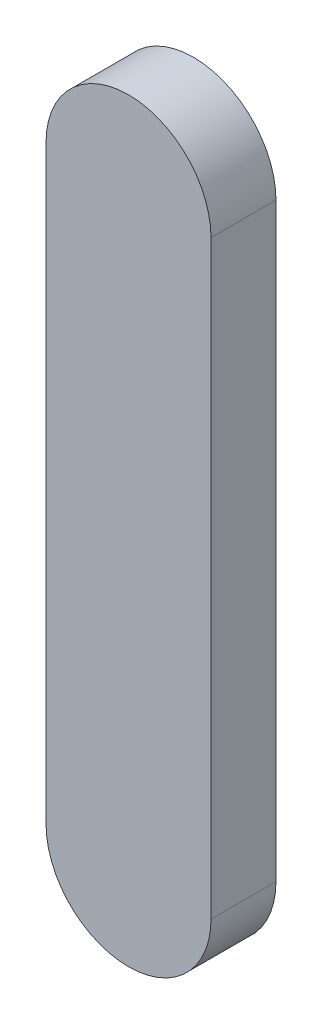
ISO-10303-21;
HEADER;
FILE_DESCRIPTION(('STEP AP214'),'2;1');
FILE_NAME('part.step','',(''),(''),'','','');
FILE_SCHEMA(('AUTOMOTIVE_DESIGN { 1 0 10303 214 1 1 1 1 }'));
ENDSEC;
DATA;
#1=APPLICATION_CONTEXT('core data for automotive mechanical design processes');
#2=APPLICATION_PROTOCOL_DEFINITION('international standard','automotive_design',2000,#1);
#3=PRODUCT_CONTEXT('',#1,'mechanical');
#4=PRODUCT('Part','Part','',(#3));
#5=PRODUCT_RELATED_PRODUCT_CATEGORY('part','',(#4));
#6=PRODUCT_DEFINITION_FORMATION('','',#4);
#7=PRODUCT_DEFINITION_CONTEXT('part definition',#1,'design');
#8=PRODUCT_DEFINITION('design','',#6,#7);
#9=PRODUCT_DEFINITION_SHAPE('','',#8);
#10=(LENGTH_UNIT() NAMED_UNIT(*) SI_UNIT(.MILLI.,.METRE.));
#11=(NAMED_UNIT(*) PLANE_ANGLE_UNIT() SI_UNIT($,.RADIAN.));
#12=(NAMED_UNIT(*) SI_UNIT($,.STERADIAN.) SOLID_ANGLE_UNIT());
#13=UNCERTAINTY_MEASURE_WITH_UNIT(LENGTH_MEASURE(1.E-05),#10,'distance_accuracy_value','');
#14=(GEOMETRIC_REPRESENTATION_CONTEXT(3) GLOBAL_UNCERTAINTY_ASSIGNED_CONTEXT((#13)) GLOBAL_UNIT_ASSIGNED_CONTEXT((#10,
#11,#12)) REPRESENTATION_CONTEXT('',''));
#15=CARTESIAN_POINT('',(0.,0.,0.));
#16=DIRECTION('',(0.,0.,1.));
#17=DIRECTION('',(1.,0.,0.));
#18=AXIS2_PLACEMENT_3D('',#15,#16,#17);
#19=CARTESIAN_POINT('',(138.049,61.087,0.));
#20=DIRECTION('',(-1.,0.,0.));
#21=DIRECTION('',(0.,1.,0.));
#22=AXIS2_PLACEMENT_3D('',#19,#20,#21);
#23=PLANE('',#22);
#24=DIRECTION('',(0.,1.,0.));
#25=VECTOR('',#24,1.);
#26=CARTESIAN_POINT('',(138.049,61.087,0.1999996));
#27=LINE('',#26,#25);
#28=CARTESIAN_POINT('',(138.049,61.087,0.1999996));
#29=VERTEX_POINT('',#28);
#30=CARTESIAN_POINT('',(138.049,62.904624,0.1999996));
#31=VERTEX_POINT('',#30);
#32=EDGE_CURVE('E11',#29,#31,#27,.T.);
#33=ORIENTED_EDGE('',*,*,#32,.F.);
#34=DIRECTION('',(0.,0.,1.));
#35=VECTOR('',#34,1.);
#36=CARTESIAN_POINT('',(138.049,61.087,0.));
#37=LINE('',#36,#35);
#38=CARTESIAN_POINT('',(138.049,61.087,0.));
#39=VERTEX_POINT('',#38);
#40=EDGE_CURVE('E24',#39,#29,#37,.T.);
#41=ORIENTED_EDGE('',*,*,#40,.F.);
#42=DIRECTION('',(0.,1.,0.));
#43=VECTOR('',#42,1.);
#44=CARTESIAN_POINT('',(138.049,61.087,0.));
#45=LINE('',#44,#43);
#46=CARTESIAN_POINT('',(138.049,62.904624,0.));
#47=VERTEX_POINT('',#46);
#48=EDGE_CURVE('E75',#39,#47,#45,.T.);
#49=ORIENTED_EDGE('',*,*,#48,.T.);
#50=DIRECTION('',(0.,0.,1.));
#51=VECTOR('',#50,1.);
#52=CARTESIAN_POINT('',(138.049,62.904624,0.));
#53=LINE('',#52,#51);
#54=EDGE_CURVE('E37',#47,#31,#53,.T.);
#55=ORIENTED_EDGE('',*,*,#54,.T.);
#56=EDGE_LOOP('',(#33,#41,#49,#55));
#57=FACE_BOUND('',#56,.T.);
#58=ADVANCED_FACE('F17',(#57),#23,.F.);
#59=CARTESIAN_POINT('',(137.795,62.904624,0.));
#60=DIRECTION('',(0.,0.,-1.));
#61=DIRECTION('',(1.,0.,0.));
#62=AXIS2_PLACEMENT_3D('',#59,#60,#61);
#63=CYLINDRICAL_SURFACE('',#62,0.254000000000003);
#64=CARTESIAN_POINT('',(137.795,62.904624,0.1999996));
#65=DIRECTION('',(0.,0.,1.));
#66=DIRECTION('',(1.,0.,0.));
#67=AXIS2_PLACEMENT_3D('',#64,#65,#66);
#68=CIRCLE('',#67,0.254000000000003);
#69=CARTESIAN_POINT('',(137.541,62.904624,0.1999996));
#70=VERTEX_POINT('',#69);
#71=EDGE_CURVE('E83',#31,#70,#68,.T.);
#72=ORIENTED_EDGE('',*,*,#71,.F.);
#73=ORIENTED_EDGE('',*,*,#54,.F.);
#74=CARTESIAN_POINT('',(137.795,62.904624,0.));
#75=DIRECTION('',(0.,0.,1.));
#76=DIRECTION('',(1.,0.,0.));
#77=AXIS2_PLACEMENT_3D('',#74,#75,#76);
#78=CIRCLE('',#77,0.254000000000003);
#79=CARTESIAN_POINT('',(137.541,62.904624,0.));
#80=VERTEX_POINT('',#79);
#81=EDGE_CURVE('E81',#47,#80,#78,.T.);
#82=ORIENTED_EDGE('',*,*,#81,.T.);
#83=DIRECTION('',(0.,0.,1.));
#84=VECTOR('',#83,1.);
#85=CARTESIAN_POINT('',(137.541,62.904624,0.));
#86=LINE('',#85,#84);
#87=EDGE_CURVE('E67',#80,#70,#86,.T.);
#88=ORIENTED_EDGE('',*,*,#87,.T.);
#89=EDGE_LOOP('',(#72,#73,#82,#88));
#90=FACE_BOUND('',#89,.T.);
#91=ADVANCED_FACE('F89',(#90),#63,.T.);
#92=CARTESIAN_POINT('',(137.541,62.904624,0.));
#93=DIRECTION('',(1.,0.,0.));
#94=DIRECTION('',(0.,-1.,0.));
#95=AXIS2_PLACEMENT_3D('',#92,#93,#94);
#96=PLANE('',#95);
#97=DIRECTION('',(0.,-1.,0.));
#98=VECTOR('',#97,1.);
#99=CARTESIAN_POINT('',(137.541,62.904624,0.1999996));
#100=LINE('',#99,#98);
#101=CARTESIAN_POINT('',(137.541,61.087,0.1999996));
#102=VERTEX_POINT('',#101);
#103=EDGE_CURVE('E71',#70,#102,#100,.T.);
#104=ORIENTED_EDGE('',*,*,#103,.F.);
#105=ORIENTED_EDGE('',*,*,#87,.F.);
#106=DIRECTION('',(0.,-1.,0.));
#107=VECTOR('',#106,1.);
#108=CARTESIAN_POINT('',(137.541,62.904624,0.));
#109=LINE('',#108,#107);
#110=CARTESIAN_POINT('',(137.541,61.087,0.));
#111=VERTEX_POINT('',#110);
#112=EDGE_CURVE('E63',#80,#111,#109,.T.);
#113=ORIENTED_EDGE('',*,*,#112,.T.);
#114=DIRECTION('',(0.,0.,1.));
#115=VECTOR('',#114,1.);
#116=CARTESIAN_POINT('',(137.541,61.087,0.));
#117=LINE('',#116,#115);
#118=EDGE_CURVE('E53',#111,#102,#117,.T.);
#119=ORIENTED_EDGE('',*,*,#118,.T.);
#120=EDGE_LOOP('',(#104,#105,#113,#119));
#121=FACE_BOUND('',#120,.T.);
#122=ADVANCED_FACE('F66',(#121),#96,.F.);
#123=CARTESIAN_POINT('',(137.795,61.087,0.));
#124=DIRECTION('',(0.,0.,-1.));
#125=DIRECTION('',(-1.,0.,0.));
#126=AXIS2_PLACEMENT_3D('',#123,#124,#125);
#127=CYLINDRICAL_SURFACE('',#126,0.254000000000005);
#128=CARTESIAN_POINT('',(137.795,61.087,0.1999996));
#129=DIRECTION('',(0.,0.,1.));
#130=DIRECTION('',(-1.,0.,0.));
#131=AXIS2_PLACEMENT_3D('',#128,#129,#130);
#132=CIRCLE('',#131,0.254000000000005);
#133=EDGE_CURVE('E59',#102,#29,#132,.T.);
#134=ORIENTED_EDGE('',*,*,#133,.F.);
#135=ORIENTED_EDGE('',*,*,#118,.F.);
#136=CARTESIAN_POINT('',(137.795,61.087,0.));
#137=DIRECTION('',(0.,0.,1.));
#138=DIRECTION('',(-1.,0.,0.));
#139=AXIS2_PLACEMENT_3D('',#136,#137,#138);
#140=CIRCLE('',#139,0.254000000000005);
#141=EDGE_CURVE('E57',#111,#39,#140,.T.);
#142=ORIENTED_EDGE('',*,*,#141,.T.);
#143=ORIENTED_EDGE('',*,*,#40,.T.);
#144=EDGE_LOOP('',(#134,#135,#142,#143));
#145=FACE_BOUND('',#144,.T.);
#146=ADVANCED_FACE('F55',(#145),#127,.T.);
#147=CARTESIAN_POINT('',(138.049,61.087,0.));
#148=DIRECTION('',(0.,0.,-1.));
#149=DIRECTION('',(-1.,0.,0.));
#150=AXIS2_PLACEMENT_3D('',#147,#148,#149);
#151=PLANE('',#150);
#152=ORIENTED_EDGE('',*,*,#141,.F.);
#153=ORIENTED_EDGE('',*,*,#112,.F.);
#154=ORIENTED_EDGE('',*,*,#81,.F.);
#155=ORIENTED_EDGE('',*,*,#48,.F.);
#156=EDGE_LOOP('',(#152,#153,#154,#155));
#157=FACE_BOUND('',#156,.T.);
#158=ADVANCED_FACE('F74',(#157),#151,.T.);
#159=CARTESIAN_POINT('',(138.049,61.087,0.1999996));
#160=DIRECTION('',(0.,0.,-1.));
#161=DIRECTION('',(-1.,0.,0.));
#162=AXIS2_PLACEMENT_3D('',#159,#160,#161);
#163=PLANE('',#162);
#164=ORIENTED_EDGE('',*,*,#32,.T.);
#165=ORIENTED_EDGE('',*,*,#71,.T.);
#166=ORIENTED_EDGE('',*,*,#103,.T.);
#167=ORIENTED_EDGE('',*,*,#133,.T.);
#168=EDGE_LOOP('',(#164,#165,#166,#167));
#169=FACE_BOUND('',#168,.T.);
#170=ADVANCED_FACE('F91',(#169),#163,.F.);
#171=CLOSED_SHELL('',(#58,#91,#122,#146,#158,#170));
#172=MANIFOLD_SOLID_BREP('B1',#171);
#173=ADVANCED_BREP_SHAPE_REPRESENTATION('',(#18,#172),#14);
#174=SHAPE_DEFINITION_REPRESENTATION(#9,#173);
ENDSEC;
END-ISO-10303-21;
